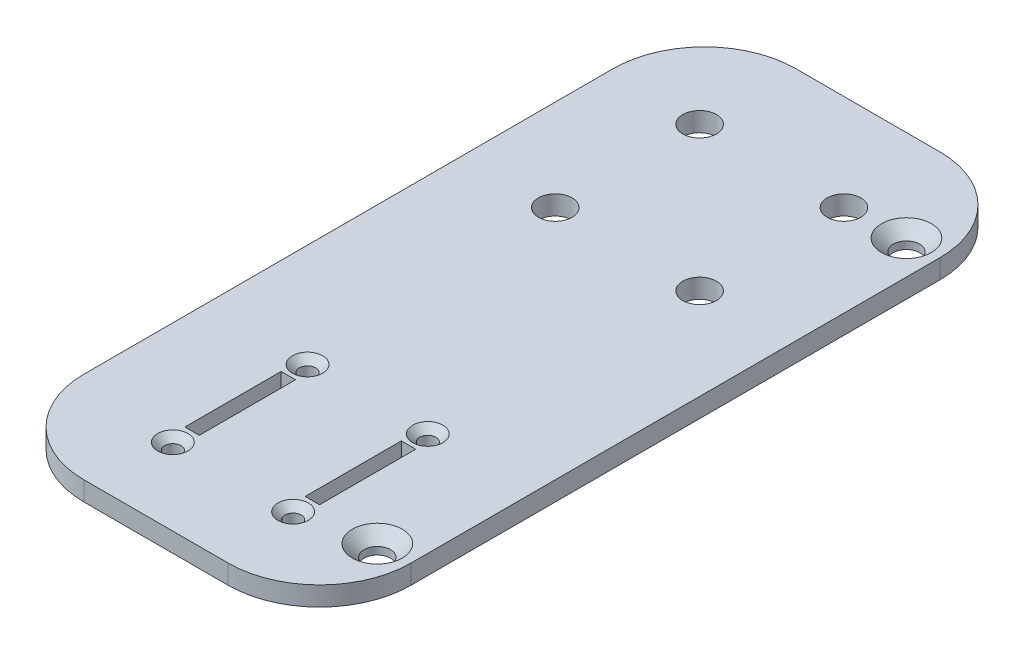
ISO-10303-21;
HEADER;
FILE_DESCRIPTION(('STEP AP214'),'2;1');
FILE_NAME('part.step','',(''),(''),'','','');
FILE_SCHEMA(('AUTOMOTIVE_DESIGN { 1 0 10303 214 1 1 1 1 }'));
ENDSEC;
DATA;
#1=APPLICATION_CONTEXT('core data for automotive mechanical design processes');
#2=APPLICATION_PROTOCOL_DEFINITION('international standard','automotive_design',2000,#1);
#3=PRODUCT_CONTEXT('',#1,'mechanical');
#4=PRODUCT('Part','Part','',(#3));
#5=PRODUCT_RELATED_PRODUCT_CATEGORY('part','',(#4));
#6=PRODUCT_DEFINITION_FORMATION('','',#4);
#7=PRODUCT_DEFINITION_CONTEXT('part definition',#1,'design');
#8=PRODUCT_DEFINITION('design','',#6,#7);
#9=PRODUCT_DEFINITION_SHAPE('','',#8);
#10=(LENGTH_UNIT() NAMED_UNIT(*) SI_UNIT(.MILLI.,.METRE.));
#11=(NAMED_UNIT(*) PLANE_ANGLE_UNIT() SI_UNIT($,.RADIAN.));
#12=(NAMED_UNIT(*) SI_UNIT($,.STERADIAN.) SOLID_ANGLE_UNIT());
#13=UNCERTAINTY_MEASURE_WITH_UNIT(LENGTH_MEASURE(1.E-05),#10,'distance_accuracy_value','');
#14=(GEOMETRIC_REPRESENTATION_CONTEXT(3) GLOBAL_UNCERTAINTY_ASSIGNED_CONTEXT((#13)) GLOBAL_UNIT_ASSIGNED_CONTEXT((#10,
#11,#12)) REPRESENTATION_CONTEXT('',''));
#15=CARTESIAN_POINT('',(0.,0.,0.));
#16=DIRECTION('',(0.,0.,1.));
#17=DIRECTION('',(1.,0.,0.));
#18=AXIS2_PLACEMENT_3D('',#15,#16,#17);
#19=CARTESIAN_POINT('',(-15.,4.,55.));
#20=DIRECTION('',(0.,1.,0.));
#21=DIRECTION('',(0.,0.,1.));
#22=AXIS2_PLACEMENT_3D('',#19,#20,#21);
#23=PLANE('',#22);
#24=CARTESIAN_POINT('',(-12.5,4.,30.));
#25=DIRECTION('',(0.,1.,0.));
#26=DIRECTION('',(0.,0.,1.));
#27=AXIS2_PLACEMENT_3D('',#24,#25,#26);
#28=CIRCLE('',#27,3.15);
#29=CARTESIAN_POINT('',(-12.5,4.,33.15));
#30=VERTEX_POINT('',#29);
#31=EDGE_CURVE('E601',#30,#30,#28,.T.);
#32=ORIENTED_EDGE('',*,*,#31,.F.);
#33=EDGE_LOOP('',(#32));
#34=FACE_BOUND('',#33,.T.);
#35=CARTESIAN_POINT('',(12.5,4.,30.));
#36=DIRECTION('',(0.,1.,0.));
#37=DIRECTION('',(0.,0.,1.));
#38=AXIS2_PLACEMENT_3D('',#35,#36,#37);
#39=CIRCLE('',#38,3.15);
#40=CARTESIAN_POINT('',(12.5,4.,33.15));
#41=VERTEX_POINT('',#40);
#42=EDGE_CURVE('E608',#41,#41,#39,.T.);
#43=ORIENTED_EDGE('',*,*,#42,.F.);
#44=EDGE_LOOP('',(#43));
#45=FACE_BOUND('',#44,.T.);
#46=CARTESIAN_POINT('',(12.5,4.,58.));
#47=DIRECTION('',(0.,1.,0.));
#48=DIRECTION('',(0.,0.,1.));
#49=AXIS2_PLACEMENT_3D('',#46,#47,#48);
#50=CIRCLE('',#49,3.15);
#51=CARTESIAN_POINT('',(12.5,4.,61.15));
#52=VERTEX_POINT('',#51);
#53=EDGE_CURVE('E617',#52,#52,#50,.T.);
#54=ORIENTED_EDGE('',*,*,#53,.F.);
#55=EDGE_LOOP('',(#54));
#56=FACE_BOUND('',#55,.T.);
#57=CARTESIAN_POINT('',(-12.5,4.,58.));
#58=DIRECTION('',(0.,1.,0.));
#59=DIRECTION('',(0.,0.,1.));
#60=AXIS2_PLACEMENT_3D('',#57,#58,#59);
#61=CIRCLE('',#60,3.15);
#62=CARTESIAN_POINT('',(-12.5,4.,61.15));
#63=VERTEX_POINT('',#62);
#64=EDGE_CURVE('E626',#63,#63,#61,.T.);
#65=ORIENTED_EDGE('',*,*,#64,.F.);
#66=EDGE_LOOP('',(#65));
#67=FACE_BOUND('',#66,.T.);
#68=CARTESIAN_POINT('',(27.,4.,-55.));
#69=DIRECTION('',(0.,1.,0.));
#70=DIRECTION('',(0.,0.,1.));
#71=AXIS2_PLACEMENT_3D('',#68,#69,#70);
#72=CIRCLE('',#71,5.2);
#73=CARTESIAN_POINT('',(27.,4.,-49.8));
#74=VERTEX_POINT('',#73);
#75=EDGE_CURVE('E635',#74,#74,#72,.T.);
#76=ORIENTED_EDGE('',*,*,#75,.F.);
#77=EDGE_LOOP('',(#76));
#78=FACE_BOUND('',#77,.T.);
#79=CARTESIAN_POINT('',(27.,4.,55.));
#80=DIRECTION('',(0.,1.,0.));
#81=DIRECTION('',(0.,0.,1.));
#82=AXIS2_PLACEMENT_3D('',#79,#80,#81);
#83=CIRCLE('',#82,5.2);
#84=CARTESIAN_POINT('',(27.,4.,60.2));
#85=VERTEX_POINT('',#84);
#86=EDGE_CURVE('E644',#85,#85,#83,.T.);
#87=ORIENTED_EDGE('',*,*,#86,.F.);
#88=EDGE_LOOP('',(#87));
#89=FACE_BOUND('',#88,.T.);
#90=CARTESIAN_POINT('',(15.,4.,-24.));
#91=DIRECTION('',(0.,1.,0.));
#92=DIRECTION('',(0.,0.,1.));
#93=AXIS2_PLACEMENT_3D('',#90,#91,#92);
#94=CIRCLE('',#93,3.5);
#95=CARTESIAN_POINT('',(15.,4.,-20.5));
#96=VERTEX_POINT('',#95);
#97=EDGE_CURVE('E192',#96,#96,#94,.T.);
#98=ORIENTED_EDGE('',*,*,#97,.F.);
#99=EDGE_LOOP('',(#98));
#100=FACE_BOUND('',#99,.T.);
#101=DIRECTION('',(-1.,0.,0.));
#102=VECTOR('',#101,1.);
#103=CARTESIAN_POINT('',(14.,4.,34.));
#104=LINE('',#103,#102);
#105=CARTESIAN_POINT('',(14.,4.,34.));
#106=VERTEX_POINT('',#105);
#107=CARTESIAN_POINT('',(11.,4.,34.));
#108=VERTEX_POINT('',#107);
#109=EDGE_CURVE('E206',#106,#108,#104,.T.);
#110=ORIENTED_EDGE('',*,*,#109,.F.);
#111=DIRECTION('',(0.,0.,-1.));
#112=VECTOR('',#111,1.);
#113=CARTESIAN_POINT('',(14.,4.,54.));
#114=LINE('',#113,#112);
#115=CARTESIAN_POINT('',(14.,4.,54.));
#116=VERTEX_POINT('',#115);
#117=EDGE_CURVE('E204',#116,#106,#114,.T.);
#118=ORIENTED_EDGE('',*,*,#117,.F.);
#119=DIRECTION('',(1.,0.,0.));
#120=VECTOR('',#119,1.);
#121=CARTESIAN_POINT('',(14.,4.,54.));
#122=LINE('',#121,#120);
#123=CARTESIAN_POINT('',(11.,4.,54.));
#124=VERTEX_POINT('',#123);
#125=EDGE_CURVE('E212',#124,#116,#122,.T.);
#126=ORIENTED_EDGE('',*,*,#125,.F.);
#127=DIRECTION('',(0.,0.,1.));
#128=VECTOR('',#127,1.);
#129=CARTESIAN_POINT('',(11.,4.,54.));
#130=LINE('',#129,#128);
#131=EDGE_CURVE('E209',#108,#124,#130,.T.);
#132=ORIENTED_EDGE('',*,*,#131,.F.);
#133=EDGE_LOOP('',(#110,#118,#126,#132));
#134=FACE_BOUND('',#133,.T.);
#135=CARTESIAN_POINT('',(-15.,4.,-54.));
#136=DIRECTION('',(0.,1.,0.));
#137=DIRECTION('',(0.,0.,1.));
#138=AXIS2_PLACEMENT_3D('',#135,#136,#137);
#139=CIRCLE('',#138,3.5);
#140=CARTESIAN_POINT('',(-15.,4.,-50.5));
#141=VERTEX_POINT('',#140);
#142=EDGE_CURVE('E235',#141,#141,#139,.T.);
#143=ORIENTED_EDGE('',*,*,#142,.F.);
#144=EDGE_LOOP('',(#143));
#145=FACE_BOUND('',#144,.T.);
#146=CARTESIAN_POINT('',(-15.,4.,55.));
#147=DIRECTION('',(0.,1.,0.));
#148=DIRECTION('',(0.,0.,1.));
#149=AXIS2_PLACEMENT_3D('',#146,#147,#148);
#150=CIRCLE('',#149,19.);
#151=CARTESIAN_POINT('',(-34.,4.,54.9999999999999));
#152=VERTEX_POINT('',#151);
#153=CARTESIAN_POINT('',(-14.9999999999999,4.,74.));
#154=VERTEX_POINT('',#153);
#155=EDGE_CURVE('E241',#152,#154,#150,.T.);
#156=ORIENTED_EDGE('',*,*,#155,.T.);
#157=DIRECTION('',(1.,0.,0.));
#158=VECTOR('',#157,1.);
#159=CARTESIAN_POINT('',(-14.9999999999999,4.,74.));
#160=LINE('',#159,#158);
#161=CARTESIAN_POINT('',(14.9999999999999,4.,74.));
#162=VERTEX_POINT('',#161);
#163=EDGE_CURVE('E244',#154,#162,#160,.T.);
#164=ORIENTED_EDGE('',*,*,#163,.T.);
#165=CARTESIAN_POINT('',(15.,4.,55.));
#166=DIRECTION('',(0.,1.,0.));
#167=DIRECTION('',(0.,0.,-1.));
#168=AXIS2_PLACEMENT_3D('',#165,#166,#167);
#169=CIRCLE('',#168,19.);
#170=CARTESIAN_POINT('',(34.,4.,54.9999999999999));
#171=VERTEX_POINT('',#170);
#172=EDGE_CURVE('E247',#162,#171,#169,.T.);
#173=ORIENTED_EDGE('',*,*,#172,.T.);
#174=DIRECTION('',(0.,0.,-1.));
#175=VECTOR('',#174,1.);
#176=CARTESIAN_POINT('',(34.,4.,54.9999999999999));
#177=LINE('',#176,#175);
#178=CARTESIAN_POINT('',(34.,4.,-54.9999999999999));
#179=VERTEX_POINT('',#178);
#180=EDGE_CURVE('E249',#171,#179,#177,.T.);
#181=ORIENTED_EDGE('',*,*,#180,.T.);
#182=CARTESIAN_POINT('',(15.,4.,-55.));
#183=DIRECTION('',(0.,1.,0.));
#184=DIRECTION('',(0.,0.,1.));
#185=AXIS2_PLACEMENT_3D('',#182,#183,#184);
#186=CIRCLE('',#185,19.);
#187=CARTESIAN_POINT('',(14.9999999999999,4.,-74.));
#188=VERTEX_POINT('',#187);
#189=EDGE_CURVE('E251',#179,#188,#186,.T.);
#190=ORIENTED_EDGE('',*,*,#189,.T.);
#191=DIRECTION('',(-1.,0.,0.));
#192=VECTOR('',#191,1.);
#193=CARTESIAN_POINT('',(-14.9999999999999,4.,-74.));
#194=LINE('',#193,#192);
#195=CARTESIAN_POINT('',(-15.,4.,-74.));
#196=VERTEX_POINT('',#195);
#197=EDGE_CURVE('E253',#188,#196,#194,.T.);
#198=ORIENTED_EDGE('',*,*,#197,.T.);
#199=CARTESIAN_POINT('',(-15.,4.,-55.));
#200=DIRECTION('',(0.,1.,0.));
#201=DIRECTION('',(0.,0.,-1.));
#202=AXIS2_PLACEMENT_3D('',#199,#200,#201);
#203=CIRCLE('',#202,19.);
#204=CARTESIAN_POINT('',(-34.,4.,-54.9999999999999));
#205=VERTEX_POINT('',#204);
#206=EDGE_CURVE('E255',#196,#205,#203,.T.);
#207=ORIENTED_EDGE('',*,*,#206,.T.);
#208=DIRECTION('',(0.,0.,1.));
#209=VECTOR('',#208,1.);
#210=CARTESIAN_POINT('',(-34.,4.,54.9999999999999));
#211=LINE('',#210,#209);
#212=EDGE_CURVE('E257',#205,#152,#211,.T.);
#213=ORIENTED_EDGE('',*,*,#212,.T.);
#214=EDGE_LOOP('',(#156,#164,#173,#181,#190,#198,#207,#213));
#215=FACE_BOUND('',#214,.T.);
#216=CARTESIAN_POINT('',(-15.,4.,-24.));
#217=DIRECTION('',(0.,1.,0.));
#218=DIRECTION('',(0.,0.,1.));
#219=AXIS2_PLACEMENT_3D('',#216,#217,#218);
#220=CIRCLE('',#219,3.5);
#221=CARTESIAN_POINT('',(-15.,4.,-20.5));
#222=VERTEX_POINT('',#221);
#223=EDGE_CURVE('E198',#222,#222,#220,.T.);
#224=ORIENTED_EDGE('',*,*,#223,.F.);
#225=EDGE_LOOP('',(#224));
#226=FACE_BOUND('',#225,.T.);
#227=CARTESIAN_POINT('',(15.,4.,-54.));
#228=DIRECTION('',(0.,1.,0.));
#229=DIRECTION('',(0.,0.,1.));
#230=AXIS2_PLACEMENT_3D('',#227,#228,#229);
#231=CIRCLE('',#230,3.5);
#232=CARTESIAN_POINT('',(15.,4.,-50.5));
#233=VERTEX_POINT('',#232);
#234=EDGE_CURVE('E186',#233,#233,#231,.T.);
#235=ORIENTED_EDGE('',*,*,#234,.F.);
#236=EDGE_LOOP('',(#235));
#237=FACE_BOUND('',#236,.T.);
#238=DIRECTION('',(-1.,0.,0.));
#239=VECTOR('',#238,1.);
#240=CARTESIAN_POINT('',(-14.,4.,34.));
#241=LINE('',#240,#239);
#242=CARTESIAN_POINT('',(-11.,4.,34.));
#243=VERTEX_POINT('',#242);
#244=CARTESIAN_POINT('',(-14.,4.,34.));
#245=VERTEX_POINT('',#244);
#246=EDGE_CURVE('E156',#243,#245,#241,.T.);
#247=ORIENTED_EDGE('',*,*,#246,.F.);
#248=DIRECTION('',(0.,0.,-1.));
#249=VECTOR('',#248,1.);
#250=CARTESIAN_POINT('',(-11.,4.,54.));
#251=LINE('',#250,#249);
#252=CARTESIAN_POINT('',(-11.,4.,54.));
#253=VERTEX_POINT('',#252);
#254=EDGE_CURVE('E148',#253,#243,#251,.T.);
#255=ORIENTED_EDGE('',*,*,#254,.F.);
#256=DIRECTION('',(1.,0.,0.));
#257=VECTOR('',#256,1.);
#258=CARTESIAN_POINT('',(-14.,4.,54.));
#259=LINE('',#258,#257);
#260=CARTESIAN_POINT('',(-14.,4.,54.));
#261=VERTEX_POINT('',#260);
#262=EDGE_CURVE('E170',#261,#253,#259,.T.);
#263=ORIENTED_EDGE('',*,*,#262,.F.);
#264=DIRECTION('',(0.,0.,1.));
#265=VECTOR('',#264,1.);
#266=CARTESIAN_POINT('',(-14.,4.,54.));
#267=LINE('',#266,#265);
#268=EDGE_CURVE('E168',#245,#261,#267,.T.);
#269=ORIENTED_EDGE('',*,*,#268,.F.);
#270=EDGE_LOOP('',(#247,#255,#263,#269));
#271=FACE_BOUND('',#270,.T.);
#272=ADVANCED_FACE('F35',(#34,#45,#56,#67,#78,#89,#100,#134,#145,#215,#226,#237,#271),#23,.T.);
#273=CARTESIAN_POINT('',(-15.,0.,55.));
#274=DIRECTION('',(0.,1.,0.));
#275=DIRECTION('',(0.,0.,1.));
#276=AXIS2_PLACEMENT_3D('',#273,#274,#275);
#277=PLANE('',#276);
#278=CARTESIAN_POINT('',(-12.5,0.,30.));
#279=DIRECTION('',(0.,1.,0.));
#280=DIRECTION('',(0.,0.,1.));
#281=AXIS2_PLACEMENT_3D('',#278,#279,#280);
#282=CIRCLE('',#281,1.7);
#283=CARTESIAN_POINT('',(-12.5,0.,31.7));
#284=VERTEX_POINT('',#283);
#285=EDGE_CURVE('E603',#284,#284,#282,.T.);
#286=ORIENTED_EDGE('',*,*,#285,.T.);
#287=EDGE_LOOP('',(#286));
#288=FACE_BOUND('',#287,.T.);
#289=CARTESIAN_POINT('',(12.5,0.,30.));
#290=DIRECTION('',(0.,1.,0.));
#291=DIRECTION('',(0.,0.,1.));
#292=AXIS2_PLACEMENT_3D('',#289,#290,#291);
#293=CIRCLE('',#292,1.7);
#294=CARTESIAN_POINT('',(12.5,0.,31.7));
#295=VERTEX_POINT('',#294);
#296=EDGE_CURVE('E614',#295,#295,#293,.T.);
#297=ORIENTED_EDGE('',*,*,#296,.T.);
#298=EDGE_LOOP('',(#297));
#299=FACE_BOUND('',#298,.T.);
#300=CARTESIAN_POINT('',(12.5,0.,58.));
#301=DIRECTION('',(0.,1.,0.));
#302=DIRECTION('',(0.,0.,1.));
#303=AXIS2_PLACEMENT_3D('',#300,#301,#302);
#304=CIRCLE('',#303,1.7);
#305=CARTESIAN_POINT('',(12.5,0.,59.7));
#306=VERTEX_POINT('',#305);
#307=EDGE_CURVE('E623',#306,#306,#304,.T.);
#308=ORIENTED_EDGE('',*,*,#307,.T.);
#309=EDGE_LOOP('',(#308));
#310=FACE_BOUND('',#309,.T.);
#311=CARTESIAN_POINT('',(-12.5,0.,58.));
#312=DIRECTION('',(0.,1.,0.));
#313=DIRECTION('',(0.,0.,1.));
#314=AXIS2_PLACEMENT_3D('',#311,#312,#313);
#315=CIRCLE('',#314,1.7);
#316=CARTESIAN_POINT('',(-12.5,0.,59.7));
#317=VERTEX_POINT('',#316);
#318=EDGE_CURVE('E632',#317,#317,#315,.T.);
#319=ORIENTED_EDGE('',*,*,#318,.T.);
#320=EDGE_LOOP('',(#319));
#321=FACE_BOUND('',#320,.T.);
#322=CARTESIAN_POINT('',(27.,0.,-55.));
#323=DIRECTION('',(0.,1.,0.));
#324=DIRECTION('',(0.,0.,1.));
#325=AXIS2_PLACEMENT_3D('',#322,#323,#324);
#326=CIRCLE('',#325,2.75);
#327=CARTESIAN_POINT('',(27.,0.,-52.25));
#328=VERTEX_POINT('',#327);
#329=EDGE_CURVE('E641',#328,#328,#326,.T.);
#330=ORIENTED_EDGE('',*,*,#329,.T.);
#331=EDGE_LOOP('',(#330));
#332=FACE_BOUND('',#331,.T.);
#333=CARTESIAN_POINT('',(27.,0.,55.));
#334=DIRECTION('',(0.,1.,0.));
#335=DIRECTION('',(0.,0.,1.));
#336=AXIS2_PLACEMENT_3D('',#333,#334,#335);
#337=CIRCLE('',#336,2.75);
#338=CARTESIAN_POINT('',(27.,0.,57.75));
#339=VERTEX_POINT('',#338);
#340=EDGE_CURVE('E176',#339,#339,#337,.T.);
#341=ORIENTED_EDGE('',*,*,#340,.T.);
#342=EDGE_LOOP('',(#341));
#343=FACE_BOUND('',#342,.T.);
#344=CARTESIAN_POINT('',(15.,0.,-54.));
#345=DIRECTION('',(0.,1.,0.));
#346=DIRECTION('',(0.,0.,1.));
#347=AXIS2_PLACEMENT_3D('',#344,#345,#346);
#348=CIRCLE('',#347,3.5);
#349=CARTESIAN_POINT('',(15.,0.,-50.5));
#350=VERTEX_POINT('',#349);
#351=EDGE_CURVE('E164',#350,#350,#348,.T.);
#352=ORIENTED_EDGE('',*,*,#351,.T.);
#353=EDGE_LOOP('',(#352));
#354=FACE_BOUND('',#353,.T.);
#355=CARTESIAN_POINT('',(15.,0.,-24.));
#356=DIRECTION('',(0.,1.,0.));
#357=DIRECTION('',(0.,0.,1.));
#358=AXIS2_PLACEMENT_3D('',#355,#356,#357);
#359=CIRCLE('',#358,3.5);
#360=CARTESIAN_POINT('',(15.,0.,-20.5));
#361=VERTEX_POINT('',#360);
#362=EDGE_CURVE('E189',#361,#361,#359,.T.);
#363=ORIENTED_EDGE('',*,*,#362,.T.);
#364=EDGE_LOOP('',(#363));
#365=FACE_BOUND('',#364,.T.);
#366=CARTESIAN_POINT('',(-15.,0.,-24.));
#367=DIRECTION('',(0.,1.,0.));
#368=DIRECTION('',(0.,0.,1.));
#369=AXIS2_PLACEMENT_3D('',#366,#367,#368);
#370=CIRCLE('',#369,3.5);
#371=CARTESIAN_POINT('',(-15.,0.,-20.5));
#372=VERTEX_POINT('',#371);
#373=EDGE_CURVE('E195',#372,#372,#370,.T.);
#374=ORIENTED_EDGE('',*,*,#373,.T.);
#375=EDGE_LOOP('',(#374));
#376=FACE_BOUND('',#375,.T.);
#377=DIRECTION('',(0.,0.,-1.));
#378=VECTOR('',#377,1.);
#379=CARTESIAN_POINT('',(14.,0.,54.));
#380=LINE('',#379,#378);
#381=CARTESIAN_POINT('',(14.,0.,54.));
#382=VERTEX_POINT('',#381);
#383=CARTESIAN_POINT('',(14.,0.,34.));
#384=VERTEX_POINT('',#383);
#385=EDGE_CURVE('E201',#382,#384,#380,.T.);
#386=ORIENTED_EDGE('',*,*,#385,.T.);
#387=DIRECTION('',(-1.,0.,0.));
#388=VECTOR('',#387,1.);
#389=CARTESIAN_POINT('',(14.,0.,34.));
#390=LINE('',#389,#388);
#391=CARTESIAN_POINT('',(11.,0.,34.));
#392=VERTEX_POINT('',#391);
#393=EDGE_CURVE('E217',#384,#392,#390,.T.);
#394=ORIENTED_EDGE('',*,*,#393,.T.);
#395=DIRECTION('',(0.,0.,1.));
#396=VECTOR('',#395,1.);
#397=CARTESIAN_POINT('',(11.,0.,54.));
#398=LINE('',#397,#396);
#399=CARTESIAN_POINT('',(11.,0.,54.));
#400=VERTEX_POINT('',#399);
#401=EDGE_CURVE('E220',#392,#400,#398,.T.);
#402=ORIENTED_EDGE('',*,*,#401,.T.);
#403=DIRECTION('',(1.,0.,0.));
#404=VECTOR('',#403,1.);
#405=CARTESIAN_POINT('',(14.,0.,54.));
#406=LINE('',#405,#404);
#407=EDGE_CURVE('E207',#400,#382,#406,.T.);
#408=ORIENTED_EDGE('',*,*,#407,.T.);
#409=EDGE_LOOP('',(#386,#394,#402,#408));
#410=FACE_BOUND('',#409,.T.);
#411=CARTESIAN_POINT('',(-15.,0.,55.));
#412=DIRECTION('',(0.,1.,0.));
#413=DIRECTION('',(0.,0.,1.));
#414=AXIS2_PLACEMENT_3D('',#411,#412,#413);
#415=CIRCLE('',#414,19.);
#416=CARTESIAN_POINT('',(-34.,0.,54.9999999999999));
#417=VERTEX_POINT('',#416);
#418=CARTESIAN_POINT('',(-14.9999999999999,0.,74.));
#419=VERTEX_POINT('',#418);
#420=EDGE_CURVE('E238',#417,#419,#415,.T.);
#421=ORIENTED_EDGE('',*,*,#420,.F.);
#422=DIRECTION('',(0.,0.,1.));
#423=VECTOR('',#422,1.);
#424=CARTESIAN_POINT('',(-34.,0.,54.9999999999999));
#425=LINE('',#424,#423);
#426=CARTESIAN_POINT('',(-34.,0.,-54.9999999999999));
#427=VERTEX_POINT('',#426);
#428=EDGE_CURVE('E245',#427,#417,#425,.T.);
#429=ORIENTED_EDGE('',*,*,#428,.F.);
#430=CARTESIAN_POINT('',(-15.,0.,-55.));
#431=DIRECTION('',(0.,1.,0.));
#432=DIRECTION('',(0.,0.,-1.));
#433=AXIS2_PLACEMENT_3D('',#430,#431,#432);
#434=CIRCLE('',#433,19.);
#435=CARTESIAN_POINT('',(-15.,0.,-74.));
#436=VERTEX_POINT('',#435);
#437=EDGE_CURVE('E272',#436,#427,#434,.T.);
#438=ORIENTED_EDGE('',*,*,#437,.F.);
#439=DIRECTION('',(-1.,0.,0.));
#440=VECTOR('',#439,1.);
#441=CARTESIAN_POINT('',(-14.9999999999999,0.,-74.));
#442=LINE('',#441,#440);
#443=CARTESIAN_POINT('',(14.9999999999999,0.,-74.));
#444=VERTEX_POINT('',#443);
#445=EDGE_CURVE('E270',#444,#436,#442,.T.);
#446=ORIENTED_EDGE('',*,*,#445,.F.);
#447=CARTESIAN_POINT('',(15.,0.,-55.));
#448=DIRECTION('',(0.,1.,0.));
#449=DIRECTION('',(0.,0.,1.));
#450=AXIS2_PLACEMENT_3D('',#447,#448,#449);
#451=CIRCLE('',#450,19.);
#452=CARTESIAN_POINT('',(34.,0.,-54.9999999999999));
#453=VERTEX_POINT('',#452);
#454=EDGE_CURVE('E268',#453,#444,#451,.T.);
#455=ORIENTED_EDGE('',*,*,#454,.F.);
#456=DIRECTION('',(0.,0.,-1.));
#457=VECTOR('',#456,1.);
#458=CARTESIAN_POINT('',(34.,0.,54.9999999999999));
#459=LINE('',#458,#457);
#460=CARTESIAN_POINT('',(34.,0.,54.9999999999999));
#461=VERTEX_POINT('',#460);
#462=EDGE_CURVE('E266',#461,#453,#459,.T.);
#463=ORIENTED_EDGE('',*,*,#462,.F.);
#464=CARTESIAN_POINT('',(15.,0.,55.));
#465=DIRECTION('',(0.,1.,0.));
#466=DIRECTION('',(0.,0.,-1.));
#467=AXIS2_PLACEMENT_3D('',#464,#465,#466);
#468=CIRCLE('',#467,19.);
#469=CARTESIAN_POINT('',(14.9999999999999,0.,74.));
#470=VERTEX_POINT('',#469);
#471=EDGE_CURVE('E264',#470,#461,#468,.T.);
#472=ORIENTED_EDGE('',*,*,#471,.F.);
#473=DIRECTION('',(1.,0.,0.));
#474=VECTOR('',#473,1.);
#475=CARTESIAN_POINT('',(-14.9999999999999,0.,74.));
#476=LINE('',#475,#474);
#477=EDGE_CURVE('E262',#419,#470,#476,.T.);
#478=ORIENTED_EDGE('',*,*,#477,.F.);
#479=EDGE_LOOP('',(#421,#429,#438,#446,#455,#463,#472,#478));
#480=FACE_BOUND('',#479,.T.);
#481=CARTESIAN_POINT('',(-15.,0.,-54.));
#482=DIRECTION('',(0.,1.,0.));
#483=DIRECTION('',(0.,0.,1.));
#484=AXIS2_PLACEMENT_3D('',#481,#482,#483);
#485=CIRCLE('',#484,3.5);
#486=CARTESIAN_POINT('',(-15.,0.,-50.5));
#487=VERTEX_POINT('',#486);
#488=EDGE_CURVE('E234',#487,#487,#485,.T.);
#489=ORIENTED_EDGE('',*,*,#488,.T.);
#490=EDGE_LOOP('',(#489));
#491=FACE_BOUND('',#490,.T.);
#492=DIRECTION('',(0.,0.,-1.));
#493=VECTOR('',#492,1.);
#494=CARTESIAN_POINT('',(-11.,0.,54.));
#495=LINE('',#494,#493);
#496=CARTESIAN_POINT('',(-11.,0.,54.));
#497=VERTEX_POINT('',#496);
#498=CARTESIAN_POINT('',(-11.,0.,34.));
#499=VERTEX_POINT('',#498);
#500=EDGE_CURVE('E58',#497,#499,#495,.T.);
#501=ORIENTED_EDGE('',*,*,#500,.T.);
#502=DIRECTION('',(-1.,0.,0.));
#503=VECTOR('',#502,1.);
#504=CARTESIAN_POINT('',(-14.,0.,34.));
#505=LINE('',#504,#503);
#506=CARTESIAN_POINT('',(-14.,0.,34.));
#507=VERTEX_POINT('',#506);
#508=EDGE_CURVE('E163',#499,#507,#505,.T.);
#509=ORIENTED_EDGE('',*,*,#508,.T.);
#510=DIRECTION('',(0.,0.,1.));
#511=VECTOR('',#510,1.);
#512=CARTESIAN_POINT('',(-14.,0.,54.));
#513=LINE('',#512,#511);
#514=CARTESIAN_POINT('',(-14.,0.,54.));
#515=VERTEX_POINT('',#514);
#516=EDGE_CURVE('E178',#507,#515,#513,.T.);
#517=ORIENTED_EDGE('',*,*,#516,.T.);
#518=DIRECTION('',(1.,0.,0.));
#519=VECTOR('',#518,1.);
#520=CARTESIAN_POINT('',(-14.,0.,54.));
#521=LINE('',#520,#519);
#522=EDGE_CURVE('E157',#515,#497,#521,.T.);
#523=ORIENTED_EDGE('',*,*,#522,.T.);
#524=EDGE_LOOP('',(#501,#509,#517,#523));
#525=FACE_BOUND('',#524,.T.);
#526=ADVANCED_FACE('F302',(#288,#299,#310,#321,#332,#343,#354,#365,#376,#410,#480,#491,#525),
#277,.F.);
#527=CARTESIAN_POINT('',(-15.,4.,55.));
#528=DIRECTION('',(0.,-1.,0.));
#529=DIRECTION('',(0.,0.,-1.));
#530=AXIS2_PLACEMENT_3D('',#527,#528,#529);
#531=CYLINDRICAL_SURFACE('',#530,19.);
#532=ORIENTED_EDGE('',*,*,#420,.T.);
#533=DIRECTION('',(0.,-1.,0.));
#534=VECTOR('',#533,1.);
#535=CARTESIAN_POINT('',(-14.9999999999999,4.,74.));
#536=LINE('',#535,#534);
#537=EDGE_CURVE('E11',#154,#419,#536,.T.);
#538=ORIENTED_EDGE('',*,*,#537,.F.);
#539=ORIENTED_EDGE('',*,*,#155,.F.);
#540=DIRECTION('',(0.,-1.,0.));
#541=VECTOR('',#540,1.);
#542=CARTESIAN_POINT('',(-34.,4.,54.9999999999999));
#543=LINE('',#542,#541);
#544=EDGE_CURVE('E259',#152,#417,#543,.T.);
#545=ORIENTED_EDGE('',*,*,#544,.T.);
#546=EDGE_LOOP('',(#532,#538,#539,#545));
#547=FACE_BOUND('',#546,.T.);
#548=ADVANCED_FACE('F37',(#547),#531,.T.);
#549=CARTESIAN_POINT('',(-14.9999999999999,4.,74.));
#550=DIRECTION('',(0.,0.,-1.));
#551=DIRECTION('',(-1.,0.,0.));
#552=AXIS2_PLACEMENT_3D('',#549,#550,#551);
#553=PLANE('',#552);
#554=ORIENTED_EDGE('',*,*,#477,.T.);
#555=DIRECTION('',(0.,-1.,0.));
#556=VECTOR('',#555,1.);
#557=CARTESIAN_POINT('',(14.9999999999999,4.,74.));
#558=LINE('',#557,#556);
#559=EDGE_CURVE('E43',#162,#470,#558,.T.);
#560=ORIENTED_EDGE('',*,*,#559,.F.);
#561=ORIENTED_EDGE('',*,*,#163,.F.);
#562=ORIENTED_EDGE('',*,*,#537,.T.);
#563=EDGE_LOOP('',(#554,#560,#561,#562));
#564=FACE_BOUND('',#563,.T.);
#565=ADVANCED_FACE('F320',(#564),#553,.F.);
#566=CARTESIAN_POINT('',(15.,4.,55.));
#567=DIRECTION('',(0.,-1.,0.));
#568=DIRECTION('',(0.,0.,-1.));
#569=AXIS2_PLACEMENT_3D('',#566,#567,#568);
#570=CYLINDRICAL_SURFACE('',#569,19.);
#571=ORIENTED_EDGE('',*,*,#471,.T.);
#572=DIRECTION('',(0.,-1.,0.));
#573=VECTOR('',#572,1.);
#574=CARTESIAN_POINT('',(34.,4.,54.9999999999999));
#575=LINE('',#574,#573);
#576=EDGE_CURVE('E289',#171,#461,#575,.T.);
#577=ORIENTED_EDGE('',*,*,#576,.F.);
#578=ORIENTED_EDGE('',*,*,#172,.F.);
#579=ORIENTED_EDGE('',*,*,#559,.T.);
#580=EDGE_LOOP('',(#571,#577,#578,#579));
#581=FACE_BOUND('',#580,.T.);
#582=ADVANCED_FACE('F296',(#581),#570,.T.);
#583=CARTESIAN_POINT('',(34.,4.,54.9999999999999));
#584=DIRECTION('',(-1.,0.,0.));
#585=DIRECTION('',(0.,0.,1.));
#586=AXIS2_PLACEMENT_3D('',#583,#584,#585);
#587=PLANE('',#586);
#588=ORIENTED_EDGE('',*,*,#462,.T.);
#589=DIRECTION('',(0.,-1.,0.));
#590=VECTOR('',#589,1.);
#591=CARTESIAN_POINT('',(34.,4.,-54.9999999999999));
#592=LINE('',#591,#590);
#593=EDGE_CURVE('E286',#179,#453,#592,.T.);
#594=ORIENTED_EDGE('',*,*,#593,.F.);
#595=ORIENTED_EDGE('',*,*,#180,.F.);
#596=ORIENTED_EDGE('',*,*,#576,.T.);
#597=EDGE_LOOP('',(#588,#594,#595,#596));
#598=FACE_BOUND('',#597,.T.);
#599=ADVANCED_FACE('F308',(#598),#587,.F.);
#600=CARTESIAN_POINT('',(15.,4.,-55.));
#601=DIRECTION('',(0.,-1.,0.));
#602=DIRECTION('',(0.,0.,-1.));
#603=AXIS2_PLACEMENT_3D('',#600,#601,#602);
#604=CYLINDRICAL_SURFACE('',#603,19.);
#605=ORIENTED_EDGE('',*,*,#454,.T.);
#606=DIRECTION('',(0.,-1.,0.));
#607=VECTOR('',#606,1.);
#608=CARTESIAN_POINT('',(14.9999999999999,4.,-74.));
#609=LINE('',#608,#607);
#610=EDGE_CURVE('E283',#188,#444,#609,.T.);
#611=ORIENTED_EDGE('',*,*,#610,.F.);
#612=ORIENTED_EDGE('',*,*,#189,.F.);
#613=ORIENTED_EDGE('',*,*,#593,.T.);
#614=EDGE_LOOP('',(#605,#611,#612,#613));
#615=FACE_BOUND('',#614,.T.);
#616=ADVANCED_FACE('F312',(#615),#604,.T.);
#617=CARTESIAN_POINT('',(-14.9999999999999,4.,-74.));
#618=DIRECTION('',(0.,0.,1.));
#619=DIRECTION('',(1.,0.,0.));
#620=AXIS2_PLACEMENT_3D('',#617,#618,#619);
#621=PLANE('',#620);
#622=ORIENTED_EDGE('',*,*,#445,.T.);
#623=DIRECTION('',(0.,-1.,0.));
#624=VECTOR('',#623,1.);
#625=CARTESIAN_POINT('',(-15.,4.,-74.));
#626=LINE('',#625,#624);
#627=EDGE_CURVE('E280',#196,#436,#626,.T.);
#628=ORIENTED_EDGE('',*,*,#627,.F.);
#629=ORIENTED_EDGE('',*,*,#197,.F.);
#630=ORIENTED_EDGE('',*,*,#610,.T.);
#631=EDGE_LOOP('',(#622,#628,#629,#630));
#632=FACE_BOUND('',#631,.T.);
#633=ADVANCED_FACE('F333',(#632),#621,.F.);
#634=CARTESIAN_POINT('',(-15.,4.,-55.));
#635=DIRECTION('',(0.,-1.,0.));
#636=DIRECTION('',(0.,0.,-1.));
#637=AXIS2_PLACEMENT_3D('',#634,#635,#636);
#638=CYLINDRICAL_SURFACE('',#637,19.);
#639=ORIENTED_EDGE('',*,*,#437,.T.);
#640=DIRECTION('',(0.,-1.,0.));
#641=VECTOR('',#640,1.);
#642=CARTESIAN_POINT('',(-34.,4.,-54.9999999999999));
#643=LINE('',#642,#641);
#644=EDGE_CURVE('E277',#205,#427,#643,.T.);
#645=ORIENTED_EDGE('',*,*,#644,.F.);
#646=ORIENTED_EDGE('',*,*,#206,.F.);
#647=ORIENTED_EDGE('',*,*,#627,.T.);
#648=EDGE_LOOP('',(#639,#645,#646,#647));
#649=FACE_BOUND('',#648,.T.);
#650=ADVANCED_FACE('F331',(#649),#638,.T.);
#651=CARTESIAN_POINT('',(-34.,4.,54.9999999999999));
#652=DIRECTION('',(1.,0.,0.));
#653=DIRECTION('',(0.,0.,-1.));
#654=AXIS2_PLACEMENT_3D('',#651,#652,#653);
#655=PLANE('',#654);
#656=ORIENTED_EDGE('',*,*,#428,.T.);
#657=ORIENTED_EDGE('',*,*,#544,.F.);
#658=ORIENTED_EDGE('',*,*,#212,.F.);
#659=ORIENTED_EDGE('',*,*,#644,.T.);
#660=EDGE_LOOP('',(#656,#657,#658,#659));
#661=FACE_BOUND('',#660,.T.);
#662=ADVANCED_FACE('F326',(#661),#655,.F.);
#663=CARTESIAN_POINT('',(-15.,4.,-54.));
#664=DIRECTION('',(0.,-1.,0.));
#665=DIRECTION('',(0.,0.,-1.));
#666=AXIS2_PLACEMENT_3D('',#663,#664,#665);
#667=CYLINDRICAL_SURFACE('',#666,3.5);
#668=ORIENTED_EDGE('',*,*,#142,.T.);
#669=EDGE_LOOP('',(#668));
#670=FACE_BOUND('',#669,.T.);
#671=ORIENTED_EDGE('',*,*,#488,.F.);
#672=EDGE_LOOP('',(#671));
#673=FACE_BOUND('',#672,.T.);
#674=ADVANCED_FACE('F353',(#670,#673),#667,.F.);
#675=CARTESIAN_POINT('',(14.,4.,54.));
#676=DIRECTION('',(-1.,0.,0.));
#677=DIRECTION('',(0.,0.,1.));
#678=AXIS2_PLACEMENT_3D('',#675,#676,#677);
#679=PLANE('',#678);
#680=ORIENTED_EDGE('',*,*,#385,.F.);
#681=DIRECTION('',(0.,-1.,0.));
#682=VECTOR('',#681,1.);
#683=CARTESIAN_POINT('',(14.,4.,54.));
#684=LINE('',#683,#682);
#685=EDGE_CURVE('E214',#116,#382,#684,.T.);
#686=ORIENTED_EDGE('',*,*,#685,.F.);
#687=ORIENTED_EDGE('',*,*,#117,.T.);
#688=DIRECTION('',(0.,-1.,0.));
#689=VECTOR('',#688,1.);
#690=CARTESIAN_POINT('',(14.,4.,34.));
#691=LINE('',#690,#689);
#692=EDGE_CURVE('E231',#106,#384,#691,.T.);
#693=ORIENTED_EDGE('',*,*,#692,.T.);
#694=EDGE_LOOP('',(#680,#686,#687,#693));
#695=FACE_BOUND('',#694,.T.);
#696=ADVANCED_FACE('F360',(#695),#679,.T.);
#697=CARTESIAN_POINT('',(14.,4.,34.));
#698=DIRECTION('',(0.,0.,1.));
#699=DIRECTION('',(1.,0.,0.));
#700=AXIS2_PLACEMENT_3D('',#697,#698,#699);
#701=PLANE('',#700);
#702=ORIENTED_EDGE('',*,*,#393,.F.);
#703=ORIENTED_EDGE('',*,*,#692,.F.);
#704=ORIENTED_EDGE('',*,*,#109,.T.);
#705=DIRECTION('',(0.,-1.,0.));
#706=VECTOR('',#705,1.);
#707=CARTESIAN_POINT('',(11.,4.,34.));
#708=LINE('',#707,#706);
#709=EDGE_CURVE('E229',#108,#392,#708,.T.);
#710=ORIENTED_EDGE('',*,*,#709,.T.);
#711=EDGE_LOOP('',(#702,#703,#704,#710));
#712=FACE_BOUND('',#711,.T.);
#713=ADVANCED_FACE('F365',(#712),#701,.T.);
#714=CARTESIAN_POINT('',(11.,4.,54.));
#715=DIRECTION('',(1.,0.,0.));
#716=DIRECTION('',(0.,0.,-1.));
#717=AXIS2_PLACEMENT_3D('',#714,#715,#716);
#718=PLANE('',#717);
#719=ORIENTED_EDGE('',*,*,#401,.F.);
#720=ORIENTED_EDGE('',*,*,#709,.F.);
#721=ORIENTED_EDGE('',*,*,#131,.T.);
#722=DIRECTION('',(0.,-1.,0.));
#723=VECTOR('',#722,1.);
#724=CARTESIAN_POINT('',(11.,4.,54.));
#725=LINE('',#724,#723);
#726=EDGE_CURVE('E227',#124,#400,#725,.T.);
#727=ORIENTED_EDGE('',*,*,#726,.T.);
#728=EDGE_LOOP('',(#719,#720,#721,#727));
#729=FACE_BOUND('',#728,.T.);
#730=ADVANCED_FACE('F407',(#729),#718,.T.);
#731=CARTESIAN_POINT('',(14.,4.,54.));
#732=DIRECTION('',(0.,0.,-1.));
#733=DIRECTION('',(-1.,0.,0.));
#734=AXIS2_PLACEMENT_3D('',#731,#732,#733);
#735=PLANE('',#734);
#736=ORIENTED_EDGE('',*,*,#407,.F.);
#737=ORIENTED_EDGE('',*,*,#726,.F.);
#738=ORIENTED_EDGE('',*,*,#125,.T.);
#739=ORIENTED_EDGE('',*,*,#685,.T.);
#740=EDGE_LOOP('',(#736,#737,#738,#739));
#741=FACE_BOUND('',#740,.T.);
#742=ADVANCED_FACE('F403',(#741),#735,.T.);
#743=CARTESIAN_POINT('',(-15.,4.,-24.));
#744=DIRECTION('',(0.,-1.,0.));
#745=DIRECTION('',(0.,0.,-1.));
#746=AXIS2_PLACEMENT_3D('',#743,#744,#745);
#747=CYLINDRICAL_SURFACE('',#746,3.5);
#748=ORIENTED_EDGE('',*,*,#223,.T.);
#749=EDGE_LOOP('',(#748));
#750=FACE_BOUND('',#749,.T.);
#751=ORIENTED_EDGE('',*,*,#373,.F.);
#752=EDGE_LOOP('',(#751));
#753=FACE_BOUND('',#752,.T.);
#754=ADVANCED_FACE('F399',(#750,#753),#747,.F.);
#755=CARTESIAN_POINT('',(15.,4.,-24.));
#756=DIRECTION('',(0.,-1.,0.));
#757=DIRECTION('',(0.,0.,-1.));
#758=AXIS2_PLACEMENT_3D('',#755,#756,#757);
#759=CYLINDRICAL_SURFACE('',#758,3.5);
#760=ORIENTED_EDGE('',*,*,#97,.T.);
#761=EDGE_LOOP('',(#760));
#762=FACE_BOUND('',#761,.T.);
#763=ORIENTED_EDGE('',*,*,#362,.F.);
#764=EDGE_LOOP('',(#763));
#765=FACE_BOUND('',#764,.T.);
#766=ADVANCED_FACE('F395',(#762,#765),#759,.F.);
#767=CARTESIAN_POINT('',(15.,4.,-54.));
#768=DIRECTION('',(0.,-1.,0.));
#769=DIRECTION('',(0.,0.,-1.));
#770=AXIS2_PLACEMENT_3D('',#767,#768,#769);
#771=CYLINDRICAL_SURFACE('',#770,3.5);
#772=ORIENTED_EDGE('',*,*,#234,.T.);
#773=EDGE_LOOP('',(#772));
#774=FACE_BOUND('',#773,.T.);
#775=ORIENTED_EDGE('',*,*,#351,.F.);
#776=EDGE_LOOP('',(#775));
#777=FACE_BOUND('',#776,.T.);
#778=ADVANCED_FACE('F392',(#774,#777),#771,.F.);
#779=CARTESIAN_POINT('',(-11.,4.,54.));
#780=DIRECTION('',(-1.,0.,0.));
#781=DIRECTION('',(0.,0.,1.));
#782=AXIS2_PLACEMENT_3D('',#779,#780,#781);
#783=PLANE('',#782);
#784=ORIENTED_EDGE('',*,*,#500,.F.);
#785=DIRECTION('',(0.,-1.,0.));
#786=VECTOR('',#785,1.);
#787=CARTESIAN_POINT('',(-11.,4.,54.));
#788=LINE('',#787,#786);
#789=EDGE_CURVE('E152',#253,#497,#788,.T.);
#790=ORIENTED_EDGE('',*,*,#789,.F.);
#791=ORIENTED_EDGE('',*,*,#254,.T.);
#792=DIRECTION('',(0.,-1.,0.));
#793=VECTOR('',#792,1.);
#794=CARTESIAN_POINT('',(-11.,4.,34.));
#795=LINE('',#794,#793);
#796=EDGE_CURVE('E151',#243,#499,#795,.T.);
#797=ORIENTED_EDGE('',*,*,#796,.T.);
#798=EDGE_LOOP('',(#784,#790,#791,#797));
#799=FACE_BOUND('',#798,.T.);
#800=ADVANCED_FACE('F150',(#799),#783,.T.);
#801=CARTESIAN_POINT('',(-14.,4.,34.));
#802=DIRECTION('',(0.,0.,1.));
#803=DIRECTION('',(1.,0.,0.));
#804=AXIS2_PLACEMENT_3D('',#801,#802,#803);
#805=PLANE('',#804);
#806=ORIENTED_EDGE('',*,*,#508,.F.);
#807=ORIENTED_EDGE('',*,*,#796,.F.);
#808=ORIENTED_EDGE('',*,*,#246,.T.);
#809=DIRECTION('',(0.,-1.,0.));
#810=VECTOR('',#809,1.);
#811=CARTESIAN_POINT('',(-14.,4.,34.));
#812=LINE('',#811,#810);
#813=EDGE_CURVE('E165',#245,#507,#812,.T.);
#814=ORIENTED_EDGE('',*,*,#813,.T.);
#815=EDGE_LOOP('',(#806,#807,#808,#814));
#816=FACE_BOUND('',#815,.T.);
#817=ADVANCED_FACE('F160',(#816),#805,.T.);
#818=CARTESIAN_POINT('',(-14.,4.,54.));
#819=DIRECTION('',(1.,0.,0.));
#820=DIRECTION('',(0.,0.,-1.));
#821=AXIS2_PLACEMENT_3D('',#818,#819,#820);
#822=PLANE('',#821);
#823=ORIENTED_EDGE('',*,*,#516,.F.);
#824=ORIENTED_EDGE('',*,*,#813,.F.);
#825=ORIENTED_EDGE('',*,*,#268,.T.);
#826=DIRECTION('',(0.,-1.,0.));
#827=VECTOR('',#826,1.);
#828=CARTESIAN_POINT('',(-14.,4.,54.));
#829=LINE('',#828,#827);
#830=EDGE_CURVE('E50',#261,#515,#829,.T.);
#831=ORIENTED_EDGE('',*,*,#830,.T.);
#832=EDGE_LOOP('',(#823,#824,#825,#831));
#833=FACE_BOUND('',#832,.T.);
#834=ADVANCED_FACE('F375',(#833),#822,.T.);
#835=CARTESIAN_POINT('',(-14.,4.,54.));
#836=DIRECTION('',(0.,0.,-1.));
#837=DIRECTION('',(-1.,0.,0.));
#838=AXIS2_PLACEMENT_3D('',#835,#836,#837);
#839=PLANE('',#838);
#840=ORIENTED_EDGE('',*,*,#522,.F.);
#841=ORIENTED_EDGE('',*,*,#830,.F.);
#842=ORIENTED_EDGE('',*,*,#262,.T.);
#843=ORIENTED_EDGE('',*,*,#789,.T.);
#844=EDGE_LOOP('',(#840,#841,#842,#843));
#845=FACE_BOUND('',#844,.T.);
#846=ADVANCED_FACE('F372',(#845),#839,.T.);
#847=CARTESIAN_POINT('',(27.,4.,55.));
#848=DIRECTION('',(0.,1.,0.));
#849=DIRECTION('',(0.,0.,1.));
#850=AXIS2_PLACEMENT_3D('',#847,#848,#849);
#851=CYLINDRICAL_SURFACE('',#850,2.75);
#852=ORIENTED_EDGE('',*,*,#340,.F.);
#853=EDGE_LOOP('',(#852));
#854=FACE_BOUND('',#853,.T.);
#855=CARTESIAN_POINT('',(27.,1.55,55.));
#856=DIRECTION('',(0.,1.,0.));
#857=DIRECTION('',(0.,0.,1.));
#858=AXIS2_PLACEMENT_3D('',#855,#856,#857);
#859=CIRCLE('',#858,2.75);
#860=CARTESIAN_POINT('',(27.,1.55,57.75));
#861=VERTEX_POINT('',#860);
#862=EDGE_CURVE('E647',#861,#861,#859,.T.);
#863=ORIENTED_EDGE('',*,*,#862,.T.);
#864=EDGE_LOOP('',(#863));
#865=FACE_BOUND('',#864,.T.);
#866=ADVANCED_FACE('F374',(#854,#865),#851,.F.);
#867=CARTESIAN_POINT('',(27.,4.,55.));
#868=DIRECTION('',(0.,1.,0.));
#869=DIRECTION('',(0.,0.,1.));
#870=AXIS2_PLACEMENT_3D('',#867,#868,#869);
#871=CONICAL_SURFACE('',#870,5.2,0.785398163397449);
#872=ORIENTED_EDGE('',*,*,#862,.F.);
#873=EDGE_LOOP('',(#872));
#874=FACE_BOUND('',#873,.T.);
#875=ORIENTED_EDGE('',*,*,#86,.T.);
#876=EDGE_LOOP('',(#875));
#877=FACE_BOUND('',#876,.T.);
#878=ADVANCED_FACE('F381',(#874,#877),#871,.F.);
#879=CARTESIAN_POINT('',(27.,4.,-55.));
#880=DIRECTION('',(0.,1.,0.));
#881=DIRECTION('',(0.,0.,1.));
#882=AXIS2_PLACEMENT_3D('',#879,#880,#881);
#883=CYLINDRICAL_SURFACE('',#882,2.75);
#884=ORIENTED_EDGE('',*,*,#329,.F.);
#885=EDGE_LOOP('',(#884));
#886=FACE_BOUND('',#885,.T.);
#887=CARTESIAN_POINT('',(27.,1.55,-55.));
#888=DIRECTION('',(0.,1.,0.));
#889=DIRECTION('',(0.,0.,1.));
#890=AXIS2_PLACEMENT_3D('',#887,#888,#889);
#891=CIRCLE('',#890,2.75);
#892=CARTESIAN_POINT('',(27.,1.55,-52.25));
#893=VERTEX_POINT('',#892);
#894=EDGE_CURVE('E638',#893,#893,#891,.T.);
#895=ORIENTED_EDGE('',*,*,#894,.T.);
#896=EDGE_LOOP('',(#895));
#897=FACE_BOUND('',#896,.T.);
#898=ADVANCED_FACE('F481',(#886,#897),#883,.F.);
#899=CARTESIAN_POINT('',(27.,4.,-55.));
#900=DIRECTION('',(0.,1.,0.));
#901=DIRECTION('',(0.,0.,1.));
#902=AXIS2_PLACEMENT_3D('',#899,#900,#901);
#903=CONICAL_SURFACE('',#902,5.2,0.785398163397449);
#904=ORIENTED_EDGE('',*,*,#894,.F.);
#905=EDGE_LOOP('',(#904));
#906=FACE_BOUND('',#905,.T.);
#907=ORIENTED_EDGE('',*,*,#75,.T.);
#908=EDGE_LOOP('',(#907));
#909=FACE_BOUND('',#908,.T.);
#910=ADVANCED_FACE('F490',(#906,#909),#903,.F.);
#911=CARTESIAN_POINT('',(-12.5,4.,58.));
#912=DIRECTION('',(0.,1.,0.));
#913=DIRECTION('',(0.,0.,1.));
#914=AXIS2_PLACEMENT_3D('',#911,#912,#913);
#915=CYLINDRICAL_SURFACE('',#914,1.7);
#916=ORIENTED_EDGE('',*,*,#318,.F.);
#917=EDGE_LOOP('',(#916));
#918=FACE_BOUND('',#917,.T.);
#919=CARTESIAN_POINT('',(-12.5,2.55,58.));
#920=DIRECTION('',(0.,1.,0.));
#921=DIRECTION('',(0.,0.,1.));
#922=AXIS2_PLACEMENT_3D('',#919,#920,#921);
#923=CIRCLE('',#922,1.7);
#924=CARTESIAN_POINT('',(-12.5,2.55,59.7));
#925=VERTEX_POINT('',#924);
#926=EDGE_CURVE('E629',#925,#925,#923,.T.);
#927=ORIENTED_EDGE('',*,*,#926,.T.);
#928=EDGE_LOOP('',(#927));
#929=FACE_BOUND('',#928,.T.);
#930=ADVANCED_FACE('F499',(#918,#929),#915,.F.);
#931=CARTESIAN_POINT('',(-12.5,4.,58.));
#932=DIRECTION('',(0.,1.,0.));
#933=DIRECTION('',(0.,0.,1.));
#934=AXIS2_PLACEMENT_3D('',#931,#932,#933);
#935=CONICAL_SURFACE('',#934,3.15,0.785398163397449);
#936=ORIENTED_EDGE('',*,*,#926,.F.);
#937=EDGE_LOOP('',(#936));
#938=FACE_BOUND('',#937,.T.);
#939=ORIENTED_EDGE('',*,*,#64,.T.);
#940=EDGE_LOOP('',(#939));
#941=FACE_BOUND('',#940,.T.);
#942=ADVANCED_FACE('F522',(#938,#941),#935,.F.);
#943=CARTESIAN_POINT('',(12.5,4.,58.));
#944=DIRECTION('',(0.,1.,0.));
#945=DIRECTION('',(0.,0.,1.));
#946=AXIS2_PLACEMENT_3D('',#943,#944,#945);
#947=CYLINDRICAL_SURFACE('',#946,1.7);
#948=ORIENTED_EDGE('',*,*,#307,.F.);
#949=EDGE_LOOP('',(#948));
#950=FACE_BOUND('',#949,.T.);
#951=CARTESIAN_POINT('',(12.5,2.55,58.));
#952=DIRECTION('',(0.,1.,0.));
#953=DIRECTION('',(0.,0.,1.));
#954=AXIS2_PLACEMENT_3D('',#951,#952,#953);
#955=CIRCLE('',#954,1.7);
#956=CARTESIAN_POINT('',(12.5,2.55,59.7));
#957=VERTEX_POINT('',#956);
#958=EDGE_CURVE('E620',#957,#957,#955,.T.);
#959=ORIENTED_EDGE('',*,*,#958,.T.);
#960=EDGE_LOOP('',(#959));
#961=FACE_BOUND('',#960,.T.);
#962=ADVANCED_FACE('F532',(#950,#961),#947,.F.);
#963=CARTESIAN_POINT('',(12.5,4.,58.));
#964=DIRECTION('',(0.,1.,0.));
#965=DIRECTION('',(0.,0.,1.));
#966=AXIS2_PLACEMENT_3D('',#963,#964,#965);
#967=CONICAL_SURFACE('',#966,3.15,0.785398163397448);
#968=ORIENTED_EDGE('',*,*,#958,.F.);
#969=EDGE_LOOP('',(#968));
#970=FACE_BOUND('',#969,.T.);
#971=ORIENTED_EDGE('',*,*,#53,.T.);
#972=EDGE_LOOP('',(#971));
#973=FACE_BOUND('',#972,.T.);
#974=ADVANCED_FACE('F542',(#970,#973),#967,.F.);
#975=CARTESIAN_POINT('',(12.5,4.,30.));
#976=DIRECTION('',(0.,1.,0.));
#977=DIRECTION('',(0.,0.,1.));
#978=AXIS2_PLACEMENT_3D('',#975,#976,#977);
#979=CYLINDRICAL_SURFACE('',#978,1.7);
#980=ORIENTED_EDGE('',*,*,#296,.F.);
#981=EDGE_LOOP('',(#980));
#982=FACE_BOUND('',#981,.T.);
#983=CARTESIAN_POINT('',(12.5,2.55,30.));
#984=DIRECTION('',(0.,1.,0.));
#985=DIRECTION('',(0.,0.,1.));
#986=AXIS2_PLACEMENT_3D('',#983,#984,#985);
#987=CIRCLE('',#986,1.7);
#988=CARTESIAN_POINT('',(12.5,2.55,31.7));
#989=VERTEX_POINT('',#988);
#990=EDGE_CURVE('E611',#989,#989,#987,.T.);
#991=ORIENTED_EDGE('',*,*,#990,.T.);
#992=EDGE_LOOP('',(#991));
#993=FACE_BOUND('',#992,.T.);
#994=ADVANCED_FACE('F552',(#982,#993),#979,.F.);
#995=CARTESIAN_POINT('',(12.5,4.,30.));
#996=DIRECTION('',(0.,1.,0.));
#997=DIRECTION('',(0.,0.,1.));
#998=AXIS2_PLACEMENT_3D('',#995,#996,#997);
#999=CONICAL_SURFACE('',#998,3.15,0.785398163397448);
#1000=ORIENTED_EDGE('',*,*,#990,.F.);
#1001=EDGE_LOOP('',(#1000));
#1002=FACE_BOUND('',#1001,.T.);
#1003=ORIENTED_EDGE('',*,*,#42,.T.);
#1004=EDGE_LOOP('',(#1003));
#1005=FACE_BOUND('',#1004,.T.);
#1006=ADVANCED_FACE('F562',(#1002,#1005),#999,.F.);
#1007=CARTESIAN_POINT('',(-12.5,4.,30.));
#1008=DIRECTION('',(0.,1.,0.));
#1009=DIRECTION('',(0.,0.,1.));
#1010=AXIS2_PLACEMENT_3D('',#1007,#1008,#1009);
#1011=CYLINDRICAL_SURFACE('',#1010,1.7);
#1012=ORIENTED_EDGE('',*,*,#285,.F.);
#1013=EDGE_LOOP('',(#1012));
#1014=FACE_BOUND('',#1013,.T.);
#1015=CARTESIAN_POINT('',(-12.5,2.55,30.));
#1016=DIRECTION('',(0.,1.,0.));
#1017=DIRECTION('',(0.,0.,1.));
#1018=AXIS2_PLACEMENT_3D('',#1015,#1016,#1017);
#1019=CIRCLE('',#1018,1.7);
#1020=CARTESIAN_POINT('',(-12.5,2.55,31.7));
#1021=VERTEX_POINT('',#1020);
#1022=EDGE_CURVE('E599',#1021,#1021,#1019,.T.);
#1023=ORIENTED_EDGE('',*,*,#1022,.T.);
#1024=EDGE_LOOP('',(#1023));
#1025=FACE_BOUND('',#1024,.T.);
#1026=ADVANCED_FACE('F572',(#1014,#1025),#1011,.F.);
#1027=CARTESIAN_POINT('',(-12.5,4.,30.));
#1028=DIRECTION('',(0.,1.,0.));
#1029=DIRECTION('',(0.,0.,1.));
#1030=AXIS2_PLACEMENT_3D('',#1027,#1028,#1029);
#1031=CONICAL_SURFACE('',#1030,3.15,0.785398163397449);
#1032=ORIENTED_EDGE('',*,*,#1022,.F.);
#1033=EDGE_LOOP('',(#1032));
#1034=FACE_BOUND('',#1033,.T.);
#1035=ORIENTED_EDGE('',*,*,#31,.T.);
#1036=EDGE_LOOP('',(#1035));
#1037=FACE_BOUND('',#1036,.T.);
#1038=ADVANCED_FACE('F582',(#1034,#1037),#1031,.F.);
#1039=CLOSED_SHELL('',(#272,#526,#548,#565,#582,#599,#616,#633,#650,#662,#674,#696,#713,#730,
#742,#754,#766,#778,#800,#817,#834,#846,#866,#878,#898,#910,#930,#942,#962,#974,#994,#1006,
#1026,#1038));
#1040=MANIFOLD_SOLID_BREP('B2',#1039);
#1041=ADVANCED_BREP_SHAPE_REPRESENTATION('',(#18,#1040),#14);
#1042=SHAPE_DEFINITION_REPRESENTATION(#9,#1041);
ENDSEC;
END-ISO-10303-21;
